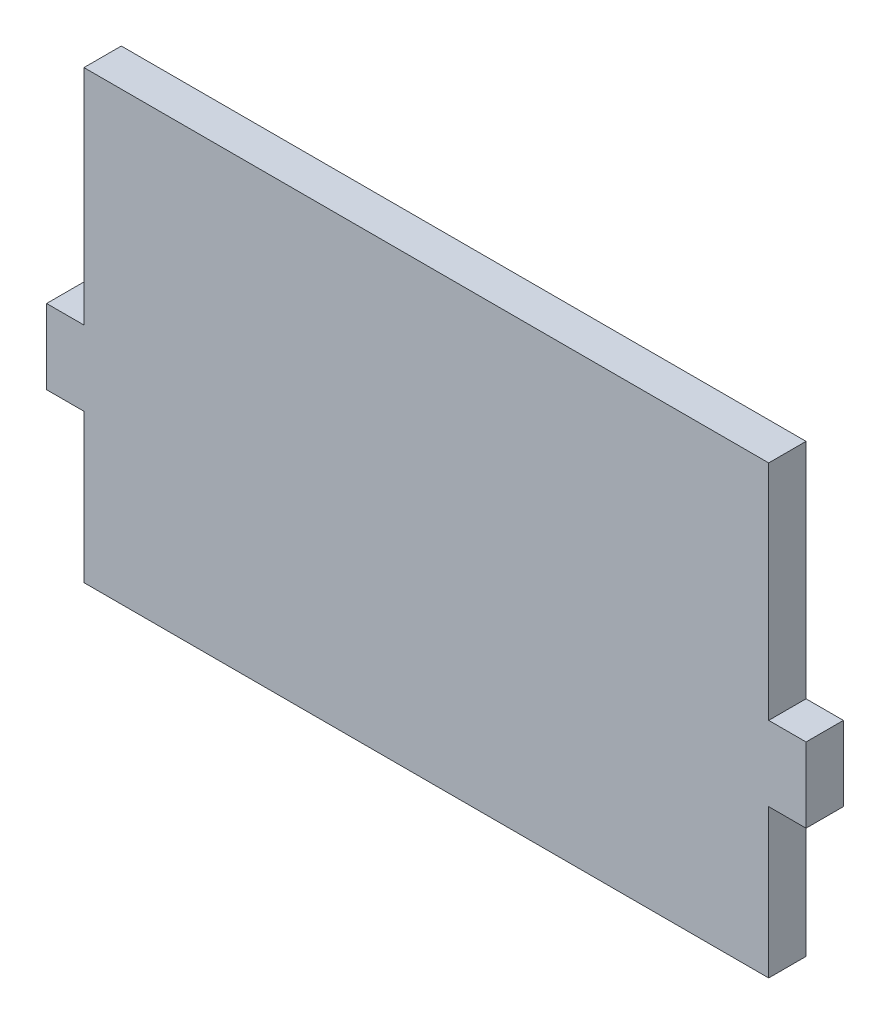
ISO-10303-21;
HEADER;
FILE_DESCRIPTION(('STEP AP214'),'2;1');
FILE_NAME('part.step','',(''),(''),'','','');
FILE_SCHEMA(('AUTOMOTIVE_DESIGN { 1 0 10303 214 1 1 1 1 }'));
ENDSEC;
DATA;
#1=APPLICATION_CONTEXT('core data for automotive mechanical design processes');
#2=APPLICATION_PROTOCOL_DEFINITION('international standard','automotive_design',2000,#1);
#3=PRODUCT_CONTEXT('',#1,'mechanical');
#4=PRODUCT('Part','Part','',(#3));
#5=PRODUCT_RELATED_PRODUCT_CATEGORY('part','',(#4));
#6=PRODUCT_DEFINITION_FORMATION('','',#4);
#7=PRODUCT_DEFINITION_CONTEXT('part definition',#1,'design');
#8=PRODUCT_DEFINITION('design','',#6,#7);
#9=PRODUCT_DEFINITION_SHAPE('','',#8);
#10=(LENGTH_UNIT() NAMED_UNIT(*) SI_UNIT(.MILLI.,.METRE.));
#11=(NAMED_UNIT(*) PLANE_ANGLE_UNIT() SI_UNIT($,.RADIAN.));
#12=(NAMED_UNIT(*) SI_UNIT($,.STERADIAN.) SOLID_ANGLE_UNIT());
#13=UNCERTAINTY_MEASURE_WITH_UNIT(LENGTH_MEASURE(1.E-05),#10,'distance_accuracy_value','');
#14=(GEOMETRIC_REPRESENTATION_CONTEXT(3) GLOBAL_UNCERTAINTY_ASSIGNED_CONTEXT((#13)) GLOBAL_UNIT_ASSIGNED_CONTEXT((#10,
#11,#12)) REPRESENTATION_CONTEXT('',''));
#15=CARTESIAN_POINT('',(0.,0.,0.));
#16=DIRECTION('',(0.,0.,1.));
#17=DIRECTION('',(1.,0.,0.));
#18=AXIS2_PLACEMENT_3D('',#15,#16,#17);
#19=CARTESIAN_POINT('',(0.,0.,3.));
#20=DIRECTION('',(1.,0.,0.));
#21=DIRECTION('',(0.,1.,0.));
#22=AXIS2_PLACEMENT_3D('',#19,#20,#21);
#23=PLANE('',#22);
#24=DIRECTION('',(0.,-1.,0.));
#25=VECTOR('',#24,1.);
#26=CARTESIAN_POINT('',(0.,0.,0.));
#27=LINE('',#26,#25);
#28=CARTESIAN_POINT('',(0.,0.,0.));
#29=VERTEX_POINT('',#28);
#30=CARTESIAN_POINT('',(0.,-17.91,0.));
#31=VERTEX_POINT('',#30);
#32=EDGE_CURVE('E159',#29,#31,#27,.T.);
#33=ORIENTED_EDGE('',*,*,#32,.T.);
#34=DIRECTION('',(0.,0.,-1.));
#35=VECTOR('',#34,1.);
#36=CARTESIAN_POINT('',(0.,-17.91,3.));
#37=LINE('',#36,#35);
#38=CARTESIAN_POINT('',(0.,-17.91,3.));
#39=VERTEX_POINT('',#38);
#40=EDGE_CURVE('E11',#39,#31,#37,.T.);
#41=ORIENTED_EDGE('',*,*,#40,.F.);
#42=DIRECTION('',(0.,-1.,0.));
#43=VECTOR('',#42,1.);
#44=CARTESIAN_POINT('',(0.,0.,3.));
#45=LINE('',#44,#43);
#46=CARTESIAN_POINT('',(0.,0.,3.));
#47=VERTEX_POINT('',#46);
#48=EDGE_CURVE('E181',#47,#39,#45,.T.);
#49=ORIENTED_EDGE('',*,*,#48,.F.);
#50=DIRECTION('',(0.,0.,-1.));
#51=VECTOR('',#50,1.);
#52=CARTESIAN_POINT('',(0.,0.,3.));
#53=LINE('',#52,#51);
#54=EDGE_CURVE('E155',#47,#29,#53,.T.);
#55=ORIENTED_EDGE('',*,*,#54,.T.);
#56=EDGE_LOOP('',(#33,#41,#49,#55));
#57=FACE_BOUND('',#56,.T.);
#58=ADVANCED_FACE('F39',(#57),#23,.F.);
#59=CARTESIAN_POINT('',(0.,-17.91,3.));
#60=DIRECTION('',(0.,-1.,0.));
#61=DIRECTION('',(0.,0.,-1.));
#62=AXIS2_PLACEMENT_3D('',#59,#60,#61);
#63=PLANE('',#62);
#64=DIRECTION('',(-1.,0.,0.));
#65=VECTOR('',#64,1.);
#66=CARTESIAN_POINT('',(0.,-17.91,0.));
#67=LINE('',#66,#65);
#68=CARTESIAN_POINT('',(-2.99999999999999,-17.91,0.));
#69=VERTEX_POINT('',#68);
#70=EDGE_CURVE('E162',#31,#69,#67,.T.);
#71=ORIENTED_EDGE('',*,*,#70,.T.);
#72=DIRECTION('',(0.,0.,-1.));
#73=VECTOR('',#72,1.);
#74=CARTESIAN_POINT('',(-2.99999999999999,-17.91,3.));
#75=LINE('',#74,#73);
#76=CARTESIAN_POINT('',(-2.99999999999999,-17.91,3.));
#77=VERTEX_POINT('',#76);
#78=EDGE_CURVE('E47',#77,#69,#75,.T.);
#79=ORIENTED_EDGE('',*,*,#78,.F.);
#80=DIRECTION('',(-1.,0.,0.));
#81=VECTOR('',#80,1.);
#82=CARTESIAN_POINT('',(0.,-17.91,3.));
#83=LINE('',#82,#81);
#84=EDGE_CURVE('E110',#39,#77,#83,.T.);
#85=ORIENTED_EDGE('',*,*,#84,.F.);
#86=ORIENTED_EDGE('',*,*,#40,.T.);
#87=EDGE_LOOP('',(#71,#79,#85,#86));
#88=FACE_BOUND('',#87,.T.);
#89=ADVANCED_FACE('F259',(#88),#63,.F.);
#90=CARTESIAN_POINT('',(-2.99999999999999,-17.91,3.));
#91=DIRECTION('',(1.,0.,0.));
#92=DIRECTION('',(0.,1.,0.));
#93=AXIS2_PLACEMENT_3D('',#90,#91,#92);
#94=PLANE('',#93);
#95=DIRECTION('',(0.,-1.,0.));
#96=VECTOR('',#95,1.);
#97=CARTESIAN_POINT('',(-2.99999999999999,-17.91,0.));
#98=LINE('',#97,#96);
#99=CARTESIAN_POINT('',(-2.99999999999999,-23.91,0.));
#100=VERTEX_POINT('',#99);
#101=EDGE_CURVE('E164',#69,#100,#98,.T.);
#102=ORIENTED_EDGE('',*,*,#101,.T.);
#103=DIRECTION('',(0.,0.,-1.));
#104=VECTOR('',#103,1.);
#105=CARTESIAN_POINT('',(-2.99999999999999,-23.91,3.));
#106=LINE('',#105,#104);
#107=CARTESIAN_POINT('',(-2.99999999999999,-23.91,3.));
#108=VERTEX_POINT('',#107);
#109=EDGE_CURVE('E200',#108,#100,#106,.T.);
#110=ORIENTED_EDGE('',*,*,#109,.F.);
#111=DIRECTION('',(0.,-1.,0.));
#112=VECTOR('',#111,1.);
#113=CARTESIAN_POINT('',(-2.99999999999999,-17.91,3.));
#114=LINE('',#113,#112);
#115=EDGE_CURVE('E208',#77,#108,#114,.T.);
#116=ORIENTED_EDGE('',*,*,#115,.F.);
#117=ORIENTED_EDGE('',*,*,#78,.T.);
#118=EDGE_LOOP('',(#102,#110,#116,#117));
#119=FACE_BOUND('',#118,.T.);
#120=ADVANCED_FACE('F206',(#119),#94,.F.);
#121=CARTESIAN_POINT('',(0.,-23.91,3.));
#122=DIRECTION('',(0.,1.,0.));
#123=DIRECTION('',(0.,0.,1.));
#124=AXIS2_PLACEMENT_3D('',#121,#122,#123);
#125=PLANE('',#124);
#126=DIRECTION('',(1.,0.,0.));
#127=VECTOR('',#126,1.);
#128=CARTESIAN_POINT('',(0.,-23.91,0.));
#129=LINE('',#128,#127);
#130=CARTESIAN_POINT('',(0.,-23.91,0.));
#131=VERTEX_POINT('',#130);
#132=EDGE_CURVE('E166',#100,#131,#129,.T.);
#133=ORIENTED_EDGE('',*,*,#132,.T.);
#134=DIRECTION('',(0.,0.,-1.));
#135=VECTOR('',#134,1.);
#136=CARTESIAN_POINT('',(0.,-23.91,3.));
#137=LINE('',#136,#135);
#138=CARTESIAN_POINT('',(0.,-23.91,3.));
#139=VERTEX_POINT('',#138);
#140=EDGE_CURVE('E197',#139,#131,#137,.T.);
#141=ORIENTED_EDGE('',*,*,#140,.F.);
#142=DIRECTION('',(1.,0.,0.));
#143=VECTOR('',#142,1.);
#144=CARTESIAN_POINT('',(0.,-23.91,3.));
#145=LINE('',#144,#143);
#146=EDGE_CURVE('E226',#108,#139,#145,.T.);
#147=ORIENTED_EDGE('',*,*,#146,.F.);
#148=ORIENTED_EDGE('',*,*,#109,.T.);
#149=EDGE_LOOP('',(#133,#141,#147,#148));
#150=FACE_BOUND('',#149,.T.);
#151=ADVANCED_FACE('F217',(#150),#125,.F.);
#152=CARTESIAN_POINT('',(0.,-23.91,3.));
#153=DIRECTION('',(1.,0.,0.));
#154=DIRECTION('',(0.,1.,0.));
#155=AXIS2_PLACEMENT_3D('',#152,#153,#154);
#156=PLANE('',#155);
#157=DIRECTION('',(0.,-1.,0.));
#158=VECTOR('',#157,1.);
#159=CARTESIAN_POINT('',(0.,-23.91,0.));
#160=LINE('',#159,#158);
#161=CARTESIAN_POINT('',(0.,-35.83,0.));
#162=VERTEX_POINT('',#161);
#163=EDGE_CURVE('E168',#131,#162,#160,.T.);
#164=ORIENTED_EDGE('',*,*,#163,.T.);
#165=DIRECTION('',(0.,0.,-1.));
#166=VECTOR('',#165,1.);
#167=CARTESIAN_POINT('',(0.,-35.83,3.));
#168=LINE('',#167,#166);
#169=CARTESIAN_POINT('',(0.,-35.83,3.));
#170=VERTEX_POINT('',#169);
#171=EDGE_CURVE('E194',#170,#162,#168,.T.);
#172=ORIENTED_EDGE('',*,*,#171,.F.);
#173=DIRECTION('',(0.,-1.,0.));
#174=VECTOR('',#173,1.);
#175=CARTESIAN_POINT('',(0.,-23.91,3.));
#176=LINE('',#175,#174);
#177=EDGE_CURVE('E223',#139,#170,#176,.T.);
#178=ORIENTED_EDGE('',*,*,#177,.F.);
#179=ORIENTED_EDGE('',*,*,#140,.T.);
#180=EDGE_LOOP('',(#164,#172,#178,#179));
#181=FACE_BOUND('',#180,.T.);
#182=ADVANCED_FACE('F221',(#181),#156,.F.);
#183=CARTESIAN_POINT('',(0.,-35.83,3.));
#184=DIRECTION('',(0.,1.,0.));
#185=DIRECTION('',(0.,0.,1.));
#186=AXIS2_PLACEMENT_3D('',#183,#184,#185);
#187=PLANE('',#186);
#188=DIRECTION('',(1.,0.,0.));
#189=VECTOR('',#188,1.);
#190=CARTESIAN_POINT('',(0.,-35.83,0.));
#191=LINE('',#190,#189);
#192=CARTESIAN_POINT('',(55.,-35.83,0.));
#193=VERTEX_POINT('',#192);
#194=EDGE_CURVE('E170',#162,#193,#191,.T.);
#195=ORIENTED_EDGE('',*,*,#194,.T.);
#196=DIRECTION('',(0.,0.,-1.));
#197=VECTOR('',#196,1.);
#198=CARTESIAN_POINT('',(55.,-35.83,3.));
#199=LINE('',#198,#197);
#200=CARTESIAN_POINT('',(55.,-35.83,3.));
#201=VERTEX_POINT('',#200);
#202=EDGE_CURVE('E191',#201,#193,#199,.T.);
#203=ORIENTED_EDGE('',*,*,#202,.F.);
#204=DIRECTION('',(1.,0.,0.));
#205=VECTOR('',#204,1.);
#206=CARTESIAN_POINT('',(0.,-35.83,3.));
#207=LINE('',#206,#205);
#208=EDGE_CURVE('E225',#170,#201,#207,.T.);
#209=ORIENTED_EDGE('',*,*,#208,.F.);
#210=ORIENTED_EDGE('',*,*,#171,.T.);
#211=EDGE_LOOP('',(#195,#203,#209,#210));
#212=FACE_BOUND('',#211,.T.);
#213=ADVANCED_FACE('F272',(#212),#187,.F.);
#214=CARTESIAN_POINT('',(55.,-23.91,3.));
#215=DIRECTION('',(-1.,0.,0.));
#216=DIRECTION('',(0.,-1.,0.));
#217=AXIS2_PLACEMENT_3D('',#214,#215,#216);
#218=PLANE('',#217);
#219=DIRECTION('',(0.,1.,0.));
#220=VECTOR('',#219,1.);
#221=CARTESIAN_POINT('',(55.,-23.91,0.));
#222=LINE('',#221,#220);
#223=CARTESIAN_POINT('',(55.,-23.91,0.));
#224=VERTEX_POINT('',#223);
#225=EDGE_CURVE('E172',#193,#224,#222,.T.);
#226=ORIENTED_EDGE('',*,*,#225,.T.);
#227=DIRECTION('',(0.,0.,-1.));
#228=VECTOR('',#227,1.);
#229=CARTESIAN_POINT('',(55.,-23.91,3.));
#230=LINE('',#229,#228);
#231=CARTESIAN_POINT('',(55.,-23.91,3.));
#232=VERTEX_POINT('',#231);
#233=EDGE_CURVE('E188',#232,#224,#230,.T.);
#234=ORIENTED_EDGE('',*,*,#233,.F.);
#235=DIRECTION('',(0.,1.,0.));
#236=VECTOR('',#235,1.);
#237=CARTESIAN_POINT('',(55.,-23.91,3.));
#238=LINE('',#237,#236);
#239=EDGE_CURVE('E228',#201,#232,#238,.T.);
#240=ORIENTED_EDGE('',*,*,#239,.F.);
#241=ORIENTED_EDGE('',*,*,#202,.T.);
#242=EDGE_LOOP('',(#226,#234,#240,#241));
#243=FACE_BOUND('',#242,.T.);
#244=ADVANCED_FACE('F275',(#243),#218,.F.);
#245=CARTESIAN_POINT('',(55.,-23.91,3.));
#246=DIRECTION('',(0.,1.,0.));
#247=DIRECTION('',(-1.,0.,0.));
#248=AXIS2_PLACEMENT_3D('',#245,#246,#247);
#249=PLANE('',#248);
#250=DIRECTION('',(1.,0.,0.));
#251=VECTOR('',#250,1.);
#252=CARTESIAN_POINT('',(55.,-23.91,0.));
#253=LINE('',#252,#251);
#254=CARTESIAN_POINT('',(58.,-23.91,0.));
#255=VERTEX_POINT('',#254);
#256=EDGE_CURVE('E174',#224,#255,#253,.T.);
#257=ORIENTED_EDGE('',*,*,#256,.T.);
#258=DIRECTION('',(0.,0.,-1.));
#259=VECTOR('',#258,1.);
#260=CARTESIAN_POINT('',(58.,-23.91,3.));
#261=LINE('',#260,#259);
#262=CARTESIAN_POINT('',(58.,-23.91,3.));
#263=VERTEX_POINT('',#262);
#264=EDGE_CURVE('E185',#263,#255,#261,.T.);
#265=ORIENTED_EDGE('',*,*,#264,.F.);
#266=DIRECTION('',(1.,0.,0.));
#267=VECTOR('',#266,1.);
#268=CARTESIAN_POINT('',(55.,-23.91,3.));
#269=LINE('',#268,#267);
#270=EDGE_CURVE('E234',#232,#263,#269,.T.);
#271=ORIENTED_EDGE('',*,*,#270,.F.);
#272=ORIENTED_EDGE('',*,*,#233,.T.);
#273=EDGE_LOOP('',(#257,#265,#271,#272));
#274=FACE_BOUND('',#273,.T.);
#275=ADVANCED_FACE('F240',(#274),#249,.F.);
#276=CARTESIAN_POINT('',(58.,-17.91,3.));
#277=DIRECTION('',(-1.,0.,0.));
#278=DIRECTION('',(0.,0.,1.));
#279=AXIS2_PLACEMENT_3D('',#276,#277,#278);
#280=PLANE('',#279);
#281=DIRECTION('',(0.,1.,0.));
#282=VECTOR('',#281,1.);
#283=CARTESIAN_POINT('',(58.,-17.91,0.));
#284=LINE('',#283,#282);
#285=CARTESIAN_POINT('',(58.,-17.91,0.));
#286=VERTEX_POINT('',#285);
#287=EDGE_CURVE('E176',#255,#286,#284,.T.);
#288=ORIENTED_EDGE('',*,*,#287,.T.);
#289=DIRECTION('',(0.,0.,-1.));
#290=VECTOR('',#289,1.);
#291=CARTESIAN_POINT('',(58.,-17.91,3.));
#292=LINE('',#291,#290);
#293=CARTESIAN_POINT('',(58.,-17.91,3.));
#294=VERTEX_POINT('',#293);
#295=EDGE_CURVE('E150',#294,#286,#292,.T.);
#296=ORIENTED_EDGE('',*,*,#295,.F.);
#297=DIRECTION('',(0.,1.,0.));
#298=VECTOR('',#297,1.);
#299=CARTESIAN_POINT('',(58.,-17.91,3.));
#300=LINE('',#299,#298);
#301=EDGE_CURVE('E141',#263,#294,#300,.T.);
#302=ORIENTED_EDGE('',*,*,#301,.F.);
#303=ORIENTED_EDGE('',*,*,#264,.T.);
#304=EDGE_LOOP('',(#288,#296,#302,#303));
#305=FACE_BOUND('',#304,.T.);
#306=ADVANCED_FACE('F244',(#305),#280,.F.);
#307=CARTESIAN_POINT('',(55.,-17.91,3.));
#308=DIRECTION('',(0.,-1.,0.));
#309=DIRECTION('',(0.,0.,-1.));
#310=AXIS2_PLACEMENT_3D('',#307,#308,#309);
#311=PLANE('',#310);
#312=DIRECTION('',(-1.,0.,0.));
#313=VECTOR('',#312,1.);
#314=CARTESIAN_POINT('',(55.,-17.91,0.));
#315=LINE('',#314,#313);
#316=CARTESIAN_POINT('',(55.,-17.91,0.));
#317=VERTEX_POINT('',#316);
#318=EDGE_CURVE('E149',#286,#317,#315,.T.);
#319=ORIENTED_EDGE('',*,*,#318,.T.);
#320=DIRECTION('',(0.,0.,-1.));
#321=VECTOR('',#320,1.);
#322=CARTESIAN_POINT('',(55.,-17.91,3.));
#323=LINE('',#322,#321);
#324=CARTESIAN_POINT('',(55.,-17.91,3.));
#325=VERTEX_POINT('',#324);
#326=EDGE_CURVE('E146',#325,#317,#323,.T.);
#327=ORIENTED_EDGE('',*,*,#326,.F.);
#328=DIRECTION('',(-1.,0.,0.));
#329=VECTOR('',#328,1.);
#330=CARTESIAN_POINT('',(55.,-17.91,3.));
#331=LINE('',#330,#329);
#332=EDGE_CURVE('E135',#294,#325,#331,.T.);
#333=ORIENTED_EDGE('',*,*,#332,.F.);
#334=ORIENTED_EDGE('',*,*,#295,.T.);
#335=EDGE_LOOP('',(#319,#327,#333,#334));
#336=FACE_BOUND('',#335,.T.);
#337=ADVANCED_FACE('F147',(#336),#311,.F.);
#338=CARTESIAN_POINT('',(55.,0.,3.));
#339=DIRECTION('',(-1.,0.,0.));
#340=DIRECTION('',(0.,-1.,0.));
#341=AXIS2_PLACEMENT_3D('',#338,#339,#340);
#342=PLANE('',#341);
#343=DIRECTION('',(0.,1.,0.));
#344=VECTOR('',#343,1.);
#345=CARTESIAN_POINT('',(55.,0.,0.));
#346=LINE('',#345,#344);
#347=CARTESIAN_POINT('',(55.,0.,0.));
#348=VERTEX_POINT('',#347);
#349=EDGE_CURVE('E96',#317,#348,#346,.T.);
#350=ORIENTED_EDGE('',*,*,#349,.T.);
#351=DIRECTION('',(0.,0.,-1.));
#352=VECTOR('',#351,1.);
#353=CARTESIAN_POINT('',(55.,0.,3.));
#354=LINE('',#353,#352);
#355=CARTESIAN_POINT('',(55.,0.,3.));
#356=VERTEX_POINT('',#355);
#357=EDGE_CURVE('E151',#356,#348,#354,.T.);
#358=ORIENTED_EDGE('',*,*,#357,.F.);
#359=DIRECTION('',(0.,1.,0.));
#360=VECTOR('',#359,1.);
#361=CARTESIAN_POINT('',(55.,0.,3.));
#362=LINE('',#361,#360);
#363=EDGE_CURVE('E139',#325,#356,#362,.T.);
#364=ORIENTED_EDGE('',*,*,#363,.F.);
#365=ORIENTED_EDGE('',*,*,#326,.T.);
#366=EDGE_LOOP('',(#350,#358,#364,#365));
#367=FACE_BOUND('',#366,.T.);
#368=ADVANCED_FACE('F153',(#367),#342,.F.);
#369=CARTESIAN_POINT('',(0.,0.,3.));
#370=DIRECTION('',(0.,-1.,0.));
#371=DIRECTION('',(0.,0.,-1.));
#372=AXIS2_PLACEMENT_3D('',#369,#370,#371);
#373=PLANE('',#372);
#374=DIRECTION('',(-1.,0.,0.));
#375=VECTOR('',#374,1.);
#376=CARTESIAN_POINT('',(0.,0.,0.));
#377=LINE('',#376,#375);
#378=EDGE_CURVE('E102',#348,#29,#377,.T.);
#379=ORIENTED_EDGE('',*,*,#378,.T.);
#380=ORIENTED_EDGE('',*,*,#54,.F.);
#381=DIRECTION('',(-1.,0.,0.));
#382=VECTOR('',#381,1.);
#383=CARTESIAN_POINT('',(0.,0.,3.));
#384=LINE('',#383,#382);
#385=EDGE_CURVE('E55',#356,#47,#384,.T.);
#386=ORIENTED_EDGE('',*,*,#385,.F.);
#387=ORIENTED_EDGE('',*,*,#357,.T.);
#388=EDGE_LOOP('',(#379,#380,#386,#387));
#389=FACE_BOUND('',#388,.T.);
#390=ADVANCED_FACE('F248',(#389),#373,.F.);
#391=CARTESIAN_POINT('',(0.,0.,3.));
#392=DIRECTION('',(0.,0.,-1.));
#393=DIRECTION('',(-1.,0.,0.));
#394=AXIS2_PLACEMENT_3D('',#391,#392,#393);
#395=PLANE('',#394);
#396=ORIENTED_EDGE('',*,*,#48,.T.);
#397=ORIENTED_EDGE('',*,*,#84,.T.);
#398=ORIENTED_EDGE('',*,*,#115,.T.);
#399=ORIENTED_EDGE('',*,*,#146,.T.);
#400=ORIENTED_EDGE('',*,*,#177,.T.);
#401=ORIENTED_EDGE('',*,*,#208,.T.);
#402=ORIENTED_EDGE('',*,*,#239,.T.);
#403=ORIENTED_EDGE('',*,*,#270,.T.);
#404=ORIENTED_EDGE('',*,*,#301,.T.);
#405=ORIENTED_EDGE('',*,*,#332,.T.);
#406=ORIENTED_EDGE('',*,*,#363,.T.);
#407=ORIENTED_EDGE('',*,*,#385,.T.);
#408=EDGE_LOOP('',(#396,#397,#398,#399,#400,#401,#402,#403,#404,#405,#406,#407));
#409=FACE_BOUND('',#408,.T.);
#410=ADVANCED_FACE('F137',(#409),#395,.F.);
#411=CARTESIAN_POINT('',(0.,0.,0.));
#412=DIRECTION('',(0.,0.,-1.));
#413=DIRECTION('',(-1.,0.,0.));
#414=AXIS2_PLACEMENT_3D('',#411,#412,#413);
#415=PLANE('',#414);
#416=ORIENTED_EDGE('',*,*,#32,.F.);
#417=ORIENTED_EDGE('',*,*,#378,.F.);
#418=ORIENTED_EDGE('',*,*,#349,.F.);
#419=ORIENTED_EDGE('',*,*,#318,.F.);
#420=ORIENTED_EDGE('',*,*,#287,.F.);
#421=ORIENTED_EDGE('',*,*,#256,.F.);
#422=ORIENTED_EDGE('',*,*,#225,.F.);
#423=ORIENTED_EDGE('',*,*,#194,.F.);
#424=ORIENTED_EDGE('',*,*,#163,.F.);
#425=ORIENTED_EDGE('',*,*,#132,.F.);
#426=ORIENTED_EDGE('',*,*,#101,.F.);
#427=ORIENTED_EDGE('',*,*,#70,.F.);
#428=EDGE_LOOP('',(#416,#417,#418,#419,#420,#421,#422,#423,#424,#425,#426,#427));
#429=FACE_BOUND('',#428,.T.);
#430=ADVANCED_FACE('F212',(#429),#415,.T.);
#431=CLOSED_SHELL('',(#58,#89,#120,#151,#182,#213,#244,#275,#306,#337,#368,#390,#410,#430));
#432=MANIFOLD_SOLID_BREP('B2',#431);
#433=ADVANCED_BREP_SHAPE_REPRESENTATION('',(#18,#432),#14);
#434=SHAPE_DEFINITION_REPRESENTATION(#9,#433);
ENDSEC;
END-ISO-10303-21;
